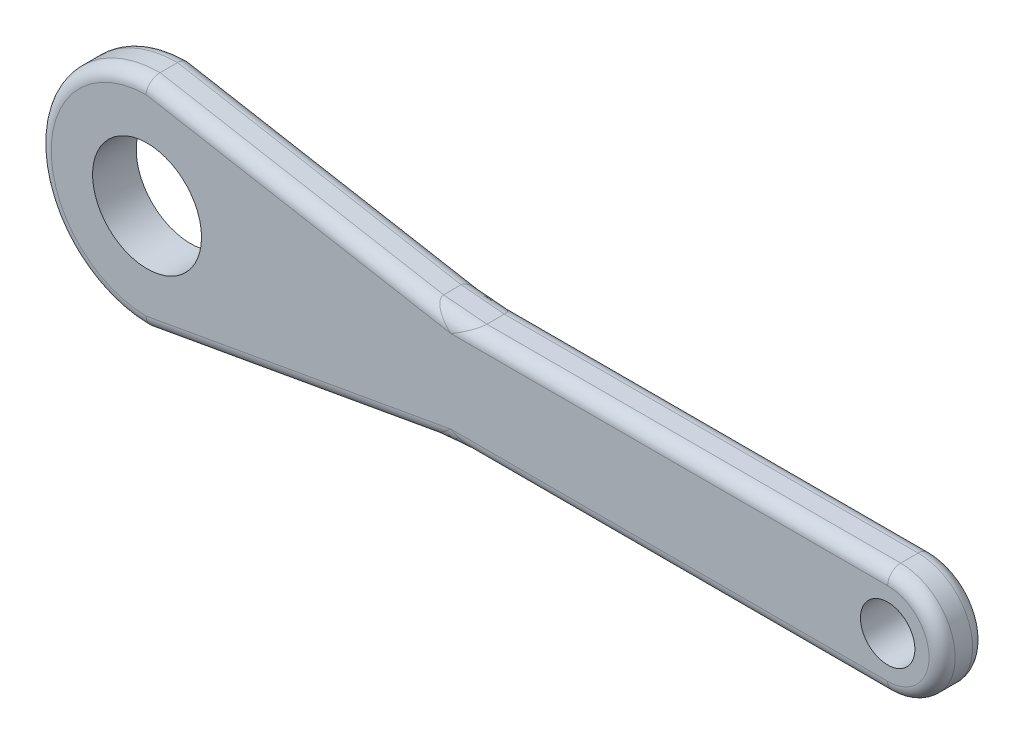
ISO-10303-21;
HEADER;
FILE_DESCRIPTION(('STEP AP214'),'2;1');
FILE_NAME('part.step','',(''),(''),'','','');
FILE_SCHEMA(('AUTOMOTIVE_DESIGN { 1 0 10303 214 1 1 1 1 }'));
ENDSEC;
DATA;
#1=APPLICATION_CONTEXT('core data for automotive mechanical design processes');
#2=APPLICATION_PROTOCOL_DEFINITION('international standard','automotive_design',2000,#1);
#3=PRODUCT_CONTEXT('',#1,'mechanical');
#4=PRODUCT('Part','Part','',(#3));
#5=PRODUCT_RELATED_PRODUCT_CATEGORY('part','',(#4));
#6=PRODUCT_DEFINITION_FORMATION('','',#4);
#7=PRODUCT_DEFINITION_CONTEXT('part definition',#1,'design');
#8=PRODUCT_DEFINITION('design','',#6,#7);
#9=PRODUCT_DEFINITION_SHAPE('','',#8);
#10=(LENGTH_UNIT() NAMED_UNIT(*) SI_UNIT(.MILLI.,.METRE.));
#11=(NAMED_UNIT(*) PLANE_ANGLE_UNIT() SI_UNIT($,.RADIAN.));
#12=(NAMED_UNIT(*) SI_UNIT($,.STERADIAN.) SOLID_ANGLE_UNIT());
#13=UNCERTAINTY_MEASURE_WITH_UNIT(LENGTH_MEASURE(1.E-05),#10,'distance_accuracy_value','');
#14=(GEOMETRIC_REPRESENTATION_CONTEXT(3) GLOBAL_UNCERTAINTY_ASSIGNED_CONTEXT((#13)) GLOBAL_UNIT_ASSIGNED_CONTEXT((#10,
#11,#12)) REPRESENTATION_CONTEXT('',''));
#15=CARTESIAN_POINT('',(0.,0.,0.));
#16=DIRECTION('',(0.,0.,1.));
#17=DIRECTION('',(1.,0.,0.));
#18=AXIS2_PLACEMENT_3D('',#15,#16,#17);
#19=CARTESIAN_POINT('',(0.,0.,10.));
#20=DIRECTION('',(0.,0.,-1.));
#21=DIRECTION('',(-1.,0.,0.));
#22=AXIS2_PLACEMENT_3D('',#19,#20,#21);
#23=CYLINDRICAL_SURFACE('',#22,25.);
#24=DIRECTION('',(0.,0.,-1.));
#25=VECTOR('',#24,1.);
#26=CARTESIAN_POINT('',(0.,-25.,10.));
#27=LINE('',#26,#25);
#28=CARTESIAN_POINT('',(0.,-25.,7.));
#29=VERTEX_POINT('',#28);
#30=CARTESIAN_POINT('',(0.,-25.,3.));
#31=VERTEX_POINT('',#30);
#32=EDGE_CURVE('E182',#29,#31,#27,.T.);
#33=ORIENTED_EDGE('',*,*,#32,.F.);
#34=CARTESIAN_POINT('',(0.,0.,7.));
#35=DIRECTION('',(0.,0.,1.));
#36=DIRECTION('',(1.,0.,0.));
#37=AXIS2_PLACEMENT_3D('',#34,#35,#36);
#38=CIRCLE('',#37,25.);
#39=CARTESIAN_POINT('',(0.,25.,7.));
#40=VERTEX_POINT('',#39);
#41=EDGE_CURVE('E396',#29,#40,#38,.F.);
#42=ORIENTED_EDGE('',*,*,#41,.T.);
#43=DIRECTION('',(0.,0.,-1.));
#44=VECTOR('',#43,1.);
#45=CARTESIAN_POINT('',(0.,25.,10.));
#46=LINE('',#45,#44);
#47=CARTESIAN_POINT('',(0.,25.,3.));
#48=VERTEX_POINT('',#47);
#49=EDGE_CURVE('E701',#40,#48,#46,.T.);
#50=ORIENTED_EDGE('',*,*,#49,.T.);
#51=CARTESIAN_POINT('',(0.,0.,3.));
#52=DIRECTION('',(0.,0.,1.));
#53=DIRECTION('',(1.,0.,0.));
#54=AXIS2_PLACEMENT_3D('',#51,#52,#53);
#55=CIRCLE('',#54,25.);
#56=EDGE_CURVE('E399',#48,#31,#55,.T.);
#57=ORIENTED_EDGE('',*,*,#56,.T.);
#58=EDGE_LOOP('',(#33,#42,#50,#57));
#59=FACE_BOUND('',#58,.T.);
#60=ADVANCED_FACE('F47',(#59),#23,.T.);
#61=CARTESIAN_POINT('',(0.,-25.,10.));
#62=DIRECTION('',(-0.175790638483658,0.984427575508482,0.));
#63=DIRECTION('',(-0.984427575508482,-0.175790638483658,0.));
#64=AXIS2_PLACEMENT_3D('',#61,#62,#63);
#65=PLANE('',#64);
#66=DIRECTION('',(0.984427575508482,0.175790638483658,0.));
#67=VECTOR('',#66,1.);
#68=CARTESIAN_POINT('',(0.,-25.,3.));
#69=LINE('',#68,#67);
#70=CARTESIAN_POINT('',(65.0778621224578,-13.3789531924183,3.));
#71=VERTEX_POINT('',#70);
#72=EDGE_CURVE('E171',#31,#71,#69,.T.);
#73=ORIENTED_EDGE('',*,*,#72,.T.);
#74=DIRECTION('',(0.,0.,1.));
#75=VECTOR('',#74,1.);
#76=CARTESIAN_POINT('',(65.0778621224578,-13.3789531924183,7.));
#77=LINE('',#76,#75);
#78=CARTESIAN_POINT('',(65.0778621224578,-13.3789531924183,7.));
#79=VERTEX_POINT('',#78);
#80=EDGE_CURVE('E716',#71,#79,#77,.T.);
#81=ORIENTED_EDGE('',*,*,#80,.T.);
#82=DIRECTION('',(0.984427575508482,0.175790638483658,0.));
#83=VECTOR('',#82,1.);
#84=CARTESIAN_POINT('',(0.,-25.,7.));
#85=LINE('',#84,#83);
#86=EDGE_CURVE('E285',#79,#29,#85,.F.);
#87=ORIENTED_EDGE('',*,*,#86,.T.);
#88=ORIENTED_EDGE('',*,*,#32,.T.);
#89=EDGE_LOOP('',(#73,#81,#87,#88));
#90=FACE_BOUND('',#89,.T.);
#91=ADVANCED_FACE('F318',(#90),#65,.F.);
#92=CARTESIAN_POINT('',(70.,-12.5,10.));
#93=DIRECTION('',(0.,1.,0.));
#94=DIRECTION('',(-1.,0.,0.));
#95=AXIS2_PLACEMENT_3D('',#92,#93,#94);
#96=PLANE('',#95);
#97=DIRECTION('',(1.,0.,0.));
#98=VECTOR('',#97,1.);
#99=CARTESIAN_POINT('',(70.,-12.5,7.));
#100=LINE('',#99,#98);
#101=CARTESIAN_POINT('',(170.,-12.5,7.));
#102=VERTEX_POINT('',#101);
#103=CARTESIAN_POINT('',(74.9999999999999,-12.5,7.));
#104=VERTEX_POINT('',#103);
#105=EDGE_CURVE('E177',#102,#104,#100,.F.);
#106=ORIENTED_EDGE('',*,*,#105,.T.);
#107=DIRECTION('',(0.,0.,-1.));
#108=VECTOR('',#107,1.);
#109=CARTESIAN_POINT('',(74.9999999999999,-12.5,3.));
#110=LINE('',#109,#108);
#111=CARTESIAN_POINT('',(74.9999999999999,-12.5,3.));
#112=VERTEX_POINT('',#111);
#113=EDGE_CURVE('E367',#104,#112,#110,.T.);
#114=ORIENTED_EDGE('',*,*,#113,.T.);
#115=DIRECTION('',(1.,0.,0.));
#116=VECTOR('',#115,1.);
#117=CARTESIAN_POINT('',(70.,-12.5,3.));
#118=LINE('',#117,#116);
#119=CARTESIAN_POINT('',(170.,-12.5,3.));
#120=VERTEX_POINT('',#119);
#121=EDGE_CURVE('E179',#112,#120,#118,.T.);
#122=ORIENTED_EDGE('',*,*,#121,.T.);
#123=DIRECTION('',(0.,0.,-1.));
#124=VECTOR('',#123,1.);
#125=CARTESIAN_POINT('',(170.,-12.5,10.));
#126=LINE('',#125,#124);
#127=EDGE_CURVE('E162',#102,#120,#126,.T.);
#128=ORIENTED_EDGE('',*,*,#127,.F.);
#129=EDGE_LOOP('',(#106,#114,#122,#128));
#130=FACE_BOUND('',#129,.T.);
#131=ADVANCED_FACE('F176',(#130),#96,.F.);
#132=CARTESIAN_POINT('',(170.,0.,10.));
#133=DIRECTION('',(0.,0.,-1.));
#134=DIRECTION('',(-1.,0.,0.));
#135=AXIS2_PLACEMENT_3D('',#132,#133,#134);
#136=CYLINDRICAL_SURFACE('',#135,12.5);
#137=ORIENTED_EDGE('',*,*,#127,.T.);
#138=CARTESIAN_POINT('',(170.,0.,3.));
#139=DIRECTION('',(0.,0.,1.));
#140=DIRECTION('',(1.,0.,0.));
#141=AXIS2_PLACEMENT_3D('',#138,#139,#140);
#142=CIRCLE('',#141,12.5);
#143=CARTESIAN_POINT('',(170.,12.5,3.));
#144=VERTEX_POINT('',#143);
#145=EDGE_CURVE('E170',#120,#144,#142,.T.);
#146=ORIENTED_EDGE('',*,*,#145,.T.);
#147=DIRECTION('',(0.,0.,-1.));
#148=VECTOR('',#147,1.);
#149=CARTESIAN_POINT('',(170.,12.5,10.));
#150=LINE('',#149,#148);
#151=CARTESIAN_POINT('',(170.,12.5,7.));
#152=VERTEX_POINT('',#151);
#153=EDGE_CURVE('E164',#152,#144,#150,.T.);
#154=ORIENTED_EDGE('',*,*,#153,.F.);
#155=CARTESIAN_POINT('',(170.,0.,7.));
#156=DIRECTION('',(0.,0.,1.));
#157=DIRECTION('',(1.,0.,0.));
#158=AXIS2_PLACEMENT_3D('',#155,#156,#157);
#159=CIRCLE('',#158,12.5);
#160=EDGE_CURVE('E159',#152,#102,#159,.F.);
#161=ORIENTED_EDGE('',*,*,#160,.T.);
#162=EDGE_LOOP('',(#137,#146,#154,#161));
#163=FACE_BOUND('',#162,.T.);
#164=ADVANCED_FACE('F161',(#163),#136,.T.);
#165=CARTESIAN_POINT('',(70.,12.5,10.));
#166=DIRECTION('',(0.,1.,0.));
#167=DIRECTION('',(-1.,0.,0.));
#168=AXIS2_PLACEMENT_3D('',#165,#166,#167);
#169=PLANE('',#168);
#170=DIRECTION('',(1.,0.,0.));
#171=VECTOR('',#170,1.);
#172=CARTESIAN_POINT('',(70.,12.5,3.));
#173=LINE('',#172,#171);
#174=CARTESIAN_POINT('',(74.9999999999997,12.5,3.));
#175=VERTEX_POINT('',#174);
#176=EDGE_CURVE('E635',#144,#175,#173,.F.);
#177=ORIENTED_EDGE('',*,*,#176,.T.);
#178=DIRECTION('',(0.,0.,1.));
#179=VECTOR('',#178,1.);
#180=CARTESIAN_POINT('',(74.9999999999997,12.5,7.));
#181=LINE('',#180,#179);
#182=CARTESIAN_POINT('',(74.9999999999997,12.5,7.));
#183=VERTEX_POINT('',#182);
#184=EDGE_CURVE('E11',#175,#183,#181,.T.);
#185=ORIENTED_EDGE('',*,*,#184,.T.);
#186=DIRECTION('',(1.,0.,0.));
#187=VECTOR('',#186,1.);
#188=CARTESIAN_POINT('',(70.,12.5,7.));
#189=LINE('',#188,#187);
#190=EDGE_CURVE('E634',#183,#152,#189,.T.);
#191=ORIENTED_EDGE('',*,*,#190,.T.);
#192=ORIENTED_EDGE('',*,*,#153,.T.);
#193=EDGE_LOOP('',(#177,#185,#191,#192));
#194=FACE_BOUND('',#193,.T.);
#195=ADVANCED_FACE('F633',(#194),#169,.T.);
#196=CARTESIAN_POINT('',(0.,25.,10.));
#197=DIRECTION('',(0.175790638483658,0.984427575508482,0.));
#198=DIRECTION('',(-0.984427575508482,0.175790638483658,0.));
#199=AXIS2_PLACEMENT_3D('',#196,#197,#198);
#200=PLANE('',#199);
#201=DIRECTION('',(0.984427575508482,-0.175790638483658,0.));
#202=VECTOR('',#201,1.);
#203=CARTESIAN_POINT('',(0.,25.,7.));
#204=LINE('',#203,#202);
#205=CARTESIAN_POINT('',(65.0778621224578,13.3789531924182,7.));
#206=VERTEX_POINT('',#205);
#207=EDGE_CURVE('E411',#40,#206,#204,.T.);
#208=ORIENTED_EDGE('',*,*,#207,.T.);
#209=DIRECTION('',(0.,0.,-1.));
#210=VECTOR('',#209,1.);
#211=CARTESIAN_POINT('',(65.0778621224578,13.3789531924182,3.));
#212=LINE('',#211,#210);
#213=CARTESIAN_POINT('',(65.0778621224578,13.3789531924182,3.));
#214=VERTEX_POINT('',#213);
#215=EDGE_CURVE('E62',#206,#214,#212,.T.);
#216=ORIENTED_EDGE('',*,*,#215,.T.);
#217=DIRECTION('',(0.984427575508482,-0.175790638483658,0.));
#218=VECTOR('',#217,1.);
#219=CARTESIAN_POINT('',(0.,25.,3.));
#220=LINE('',#219,#218);
#221=EDGE_CURVE('E402',#214,#48,#220,.F.);
#222=ORIENTED_EDGE('',*,*,#221,.T.);
#223=ORIENTED_EDGE('',*,*,#49,.F.);
#224=EDGE_LOOP('',(#208,#216,#222,#223));
#225=FACE_BOUND('',#224,.T.);
#226=ADVANCED_FACE('F740',(#225),#200,.T.);
#227=CARTESIAN_POINT('',(0.,0.,10.));
#228=DIRECTION('',(0.,0.,1.));
#229=DIRECTION('',(1.,0.,0.));
#230=AXIS2_PLACEMENT_3D('',#227,#228,#229);
#231=PLANE('',#230);
#232=DIRECTION('',(0.984427575508482,0.175790638483658,0.));
#233=VECTOR('',#232,1.);
#234=CARTESIAN_POINT('',(69.472628084549,-9.54671727347455,10.));
#235=LINE('',#234,#233);
#236=CARTESIAN_POINT('',(-0.257327238388273,-21.9984950097134,10.));
#237=VERTEX_POINT('',#236);
#238=CARTESIAN_POINT('',(69.7342448160065,-9.5,10.));
#239=VERTEX_POINT('',#238);
#240=EDGE_CURVE('E280',#237,#239,#235,.T.);
#241=ORIENTED_EDGE('',*,*,#240,.T.);
#242=DIRECTION('',(1.,0.,0.));
#243=VECTOR('',#242,1.);
#244=CARTESIAN_POINT('',(170.,-9.50000000000001,10.));
#245=LINE('',#244,#243);
#246=CARTESIAN_POINT('',(170.,-9.50000000000001,10.));
#247=VERTEX_POINT('',#246);
#248=EDGE_CURVE('E288',#239,#247,#245,.T.);
#249=ORIENTED_EDGE('',*,*,#248,.T.);
#250=CARTESIAN_POINT('',(170.,0.,10.));
#251=DIRECTION('',(0.,0.,1.));
#252=DIRECTION('',(1.,0.,0.));
#253=AXIS2_PLACEMENT_3D('',#250,#251,#252);
#254=CIRCLE('',#253,9.50000000000001);
#255=CARTESIAN_POINT('',(170.,9.50000000000001,10.));
#256=VERTEX_POINT('',#255);
#257=EDGE_CURVE('E196',#247,#256,#254,.T.);
#258=ORIENTED_EDGE('',*,*,#257,.T.);
#259=DIRECTION('',(1.,0.,0.));
#260=VECTOR('',#259,1.);
#261=CARTESIAN_POINT('',(0.,9.5,10.));
#262=LINE('',#261,#260);
#263=CARTESIAN_POINT('',(69.7342448160065,9.5,10.));
#264=VERTEX_POINT('',#263);
#265=EDGE_CURVE('E281',#256,#264,#262,.F.);
#266=ORIENTED_EDGE('',*,*,#265,.T.);
#267=DIRECTION('',(0.984427575508482,-0.175790638483658,0.));
#268=VECTOR('',#267,1.);
#269=CARTESIAN_POINT('',(3.7989568855379,21.2741585590123,10.));
#270=LINE('',#269,#268);
#271=CARTESIAN_POINT('',(-0.257327238388275,21.9984950097134,10.));
#272=VERTEX_POINT('',#271);
#273=EDGE_CURVE('E276',#264,#272,#270,.F.);
#274=ORIENTED_EDGE('',*,*,#273,.T.);
#275=CARTESIAN_POINT('',(0.,0.,10.));
#276=DIRECTION('',(0.,0.,1.));
#277=DIRECTION('',(1.,0.,0.));
#278=AXIS2_PLACEMENT_3D('',#275,#276,#277);
#279=CIRCLE('',#278,22.);
#280=EDGE_CURVE('E273',#272,#237,#279,.T.);
#281=ORIENTED_EDGE('',*,*,#280,.T.);
#282=EDGE_LOOP('',(#241,#249,#258,#266,#274,#281));
#283=FACE_BOUND('',#282,.T.);
#284=CARTESIAN_POINT('',(0.,0.,10.));
#285=DIRECTION('',(0.,0.,1.));
#286=DIRECTION('',(1.,0.,0.));
#287=AXIS2_PLACEMENT_3D('',#284,#285,#286);
#288=CIRCLE('',#287,12.5);
#289=CARTESIAN_POINT('',(12.5,0.,10.));
#290=VERTEX_POINT('',#289);
#291=EDGE_CURVE('E697',#290,#290,#288,.T.);
#292=ORIENTED_EDGE('',*,*,#291,.F.);
#293=EDGE_LOOP('',(#292));
#294=FACE_BOUND('',#293,.T.);
#295=CARTESIAN_POINT('',(170.,0.,10.));
#296=DIRECTION('',(0.,0.,1.));
#297=DIRECTION('',(1.,0.,0.));
#298=AXIS2_PLACEMENT_3D('',#295,#296,#297);
#299=CIRCLE('',#298,6.25);
#300=CARTESIAN_POINT('',(176.25,0.,10.));
#301=VERTEX_POINT('',#300);
#302=EDGE_CURVE('E691',#301,#301,#299,.T.);
#303=ORIENTED_EDGE('',*,*,#302,.F.);
#304=EDGE_LOOP('',(#303));
#305=FACE_BOUND('',#304,.T.);
#306=ADVANCED_FACE('F742',(#283,#294,#305),#231,.T.);
#307=CARTESIAN_POINT('',(0.,0.,0.));
#308=DIRECTION('',(0.,0.,1.));
#309=DIRECTION('',(1.,0.,0.));
#310=AXIS2_PLACEMENT_3D('',#307,#308,#309);
#311=PLANE('',#310);
#312=CARTESIAN_POINT('',(170.,0.,0.));
#313=DIRECTION('',(0.,0.,1.));
#314=DIRECTION('',(1.,0.,0.));
#315=AXIS2_PLACEMENT_3D('',#312,#313,#314);
#316=CIRCLE('',#315,9.50000000000001);
#317=CARTESIAN_POINT('',(170.,9.50000000000001,0.));
#318=VERTEX_POINT('',#317);
#319=CARTESIAN_POINT('',(170.,-9.50000000000001,0.));
#320=VERTEX_POINT('',#319);
#321=EDGE_CURVE('E268',#318,#320,#316,.F.);
#322=ORIENTED_EDGE('',*,*,#321,.T.);
#323=DIRECTION('',(1.,0.,0.));
#324=VECTOR('',#323,1.);
#325=CARTESIAN_POINT('',(0.,-9.5,0.));
#326=LINE('',#325,#324);
#327=CARTESIAN_POINT('',(69.7342448160065,-9.5,0.));
#328=VERTEX_POINT('',#327);
#329=EDGE_CURVE('E277',#320,#328,#326,.F.);
#330=ORIENTED_EDGE('',*,*,#329,.T.);
#331=DIRECTION('',(0.984427575508482,0.175790638483658,0.));
#332=VECTOR('',#331,1.);
#333=CARTESIAN_POINT('',(3.7989568855379,-21.2741585590123,0.));
#334=LINE('',#333,#332);
#335=CARTESIAN_POINT('',(-0.257327238388275,-21.9984950097134,0.));
#336=VERTEX_POINT('',#335);
#337=EDGE_CURVE('E271',#328,#336,#334,.F.);
#338=ORIENTED_EDGE('',*,*,#337,.T.);
#339=CARTESIAN_POINT('',(0.,0.,0.));
#340=DIRECTION('',(0.,0.,1.));
#341=DIRECTION('',(1.,0.,0.));
#342=AXIS2_PLACEMENT_3D('',#339,#340,#341);
#343=CIRCLE('',#342,22.);
#344=CARTESIAN_POINT('',(-0.257327238388273,21.9984950097134,0.));
#345=VERTEX_POINT('',#344);
#346=EDGE_CURVE('E258',#336,#345,#343,.F.);
#347=ORIENTED_EDGE('',*,*,#346,.T.);
#348=DIRECTION('',(0.984427575508482,-0.175790638483658,0.));
#349=VECTOR('',#348,1.);
#350=CARTESIAN_POINT('',(69.472628084549,9.54671727347455,0.));
#351=LINE('',#350,#349);
#352=CARTESIAN_POINT('',(69.7342448160065,9.5,0.));
#353=VERTEX_POINT('',#352);
#354=EDGE_CURVE('E267',#345,#353,#351,.T.);
#355=ORIENTED_EDGE('',*,*,#354,.T.);
#356=DIRECTION('',(1.,0.,0.));
#357=VECTOR('',#356,1.);
#358=CARTESIAN_POINT('',(170.,9.50000000000001,0.));
#359=LINE('',#358,#357);
#360=EDGE_CURVE('E272',#353,#318,#359,.T.);
#361=ORIENTED_EDGE('',*,*,#360,.T.);
#362=EDGE_LOOP('',(#322,#330,#338,#347,#355,#361));
#363=FACE_BOUND('',#362,.T.);
#364=CARTESIAN_POINT('',(0.,0.,0.));
#365=DIRECTION('',(0.,0.,1.));
#366=DIRECTION('',(1.,0.,0.));
#367=AXIS2_PLACEMENT_3D('',#364,#365,#366);
#368=CIRCLE('',#367,12.5);
#369=CARTESIAN_POINT('',(12.5,0.,0.));
#370=VERTEX_POINT('',#369);
#371=EDGE_CURVE('E705',#370,#370,#368,.T.);
#372=ORIENTED_EDGE('',*,*,#371,.T.);
#373=EDGE_LOOP('',(#372));
#374=FACE_BOUND('',#373,.T.);
#375=CARTESIAN_POINT('',(170.,0.,0.));
#376=DIRECTION('',(0.,0.,1.));
#377=DIRECTION('',(1.,0.,0.));
#378=AXIS2_PLACEMENT_3D('',#375,#376,#377);
#379=CIRCLE('',#378,6.25);
#380=CARTESIAN_POINT('',(176.25,0.,0.));
#381=VERTEX_POINT('',#380);
#382=EDGE_CURVE('E688',#381,#381,#379,.T.);
#383=ORIENTED_EDGE('',*,*,#382,.T.);
#384=EDGE_LOOP('',(#383));
#385=FACE_BOUND('',#384,.T.);
#386=ADVANCED_FACE('F680',(#363,#374,#385),#311,.F.);
#387=CARTESIAN_POINT('',(170.,0.,0.));
#388=DIRECTION('',(0.,0.,1.));
#389=DIRECTION('',(1.,0.,0.));
#390=AXIS2_PLACEMENT_3D('',#387,#388,#389);
#391=CYLINDRICAL_SURFACE('',#390,6.25);
#392=ORIENTED_EDGE('',*,*,#382,.F.);
#393=EDGE_LOOP('',(#392));
#394=FACE_BOUND('',#393,.T.);
#395=ORIENTED_EDGE('',*,*,#302,.T.);
#396=EDGE_LOOP('',(#395));
#397=FACE_BOUND('',#396,.T.);
#398=ADVANCED_FACE('F787',(#394,#397),#391,.F.);
#399=CARTESIAN_POINT('',(0.,0.,0.));
#400=DIRECTION('',(0.,0.,1.));
#401=DIRECTION('',(1.,0.,0.));
#402=AXIS2_PLACEMENT_3D('',#399,#400,#401);
#403=CYLINDRICAL_SURFACE('',#402,12.5);
#404=ORIENTED_EDGE('',*,*,#371,.F.);
#405=EDGE_LOOP('',(#404));
#406=FACE_BOUND('',#405,.T.);
#407=ORIENTED_EDGE('',*,*,#291,.T.);
#408=EDGE_LOOP('',(#407));
#409=FACE_BOUND('',#408,.T.);
#410=ADVANCED_FACE('F795',(#406,#409),#403,.F.);
#411=CARTESIAN_POINT('',(3.7989568855379,21.2741585590123,3.));
#412=DIRECTION('',(-0.984427575508482,0.175790638483658,0.));
#413=DIRECTION('',(-0.175790638483658,-0.984427575508482,0.));
#414=AXIS2_PLACEMENT_3D('',#411,#412,#413);
#415=CYLINDRICAL_SURFACE('',#414,3.);
#416=ORIENTED_EDGE('',*,*,#221,.F.);
#417=CARTESIAN_POINT('',(69.7342448160066,9.49999999999999,0.));
#418=CARTESIAN_POINT('',(68.5135068743807,10.516923575104,-0.00318682172784394));
#419=CARTESIAN_POINT('',(67.3048815947981,11.5237568178204,0.322542018701456));
#420=CARTESIAN_POINT('',(65.5784884803991,12.9619113947079,1.43481729417927));
#421=CARTESIAN_POINT('',(65.0729157686108,13.3830737031899,2.21350669266261));
#422=CARTESIAN_POINT('',(65.0778621224578,13.3789531924182,3.));
#423=B_SPLINE_CURVE_WITH_KNOTS('',3,(#417,#418,#419,#420,#421,#422),.UNSPECIFIED.,.F.,.F.,(4,2,
4),(3.14159265358979,3.92699081698724,4.71238898038469),.UNSPECIFIED.);
#424=EDGE_CURVE('E418',#214,#353,#423,.F.);
#425=ORIENTED_EDGE('',*,*,#424,.T.);
#426=ORIENTED_EDGE('',*,*,#354,.F.);
#427=CARTESIAN_POINT('',(0.,25.,3.));
#428=CARTESIAN_POINT('',(8.7085151027393E-07,25.0000082337955,2.91586638756877));
#429=CARTESIAN_POINT('',(-0.0003135154808949,24.9964608064281,2.83173670505606));
#430=CARTESIAN_POINT('',(-0.00156613641970176,24.982318313516,2.66408097308371));
#431=CARTESIAN_POINT('',(-0.0025043365825294,24.9717236370815,2.58055489055396));
#432=CARTESIAN_POINT('',(-0.00499692725475994,24.9435615386325,2.41475877472728));
#433=CARTESIAN_POINT('',(-0.00655082630696407,24.9259996778824,2.33248779385642));
#434=CARTESIAN_POINT('',(-0.0102599497474648,24.8840482785992,2.16974393992692));
#435=CARTESIAN_POINT('',(-0.0124151676501333,24.8596588137064,2.08927104748481));
#436=CARTESIAN_POINT('',(-0.019760905491985,24.7764533568628,1.85133186340131));
#437=CARTESIAN_POINT('',(-0.0258326410623305,24.7075875671628,1.69727052085856));
#438=CARTESIAN_POINT('',(-0.0401121156190309,24.5451545024943,1.40303346952755));
#439=CARTESIAN_POINT('',(-0.0483194238592753,24.4515922087684,1.2628549684259));
#440=CARTESIAN_POINT('',(-0.0666154871435365,24.2422447713745,0.999950759377807));
#441=CARTESIAN_POINT('',(-0.0767072633191261,24.126423934548,0.877253641936504));
#442=CARTESIAN_POINT('',(-0.0984370575409814,23.875926174408,0.652999626413795));
#443=CARTESIAN_POINT('',(-0.110075567702717,23.7412432491153,0.551449483049751));
#444=CARTESIAN_POINT('',(-0.134571177341969,23.4563246908936,0.371986271246784));
#445=CARTESIAN_POINT('',(-0.147432907765865,23.3060297376252,0.294168134350286));
#446=CARTESIAN_POINT('',(-0.173929893750998,22.9946225172639,0.164905367377188));
#447=CARTESIAN_POINT('',(-0.187564574985776,22.833518265893,0.113441433343793));
#448=CARTESIAN_POINT('',(-0.210280249340345,22.5634514797078,0.0515676925899749));
#449=CARTESIAN_POINT('',(-0.219261848938276,22.4562531723518,0.0330715027635641));
#450=CARTESIAN_POINT('',(-0.237256163085491,22.2405976776065,0.00780570670213559));
#451=CARTESIAN_POINT('',(-0.246268801416115,22.1321428705333,0.00101672013653875));
#452=CARTESIAN_POINT('',(-0.255936348115522,22.015312045615,3.51960844525561E-05));
#453=CARTESIAN_POINT('',(-0.256631931223679,22.006903253676,-9.1545239450453E-08));
#454=CARTESIAN_POINT('',(-0.25732723838826,21.9984950097134,0.));
#455=B_SPLINE_CURVE_WITH_KNOTS('',3,(#427,#428,#429,#430,#431,#432,#433,#434,#435,#436,#437,
#438,#439,#440,#441,#442,#443,#444,#445,#446,#447,#448,#449,#450,#451,#452,#453,#454),
.UNSPECIFIED.,.F.,.F.,(4,2,2,2,2,2,2,2,2,2,2,2,2,4),(0.,0.25231842788974,0.504622925298267,
0.756726435059673,1.00882722582033,1.5128047677286,2.01668073579764,2.52137155053236,
3.026223325997,3.53306886646753,4.03954261918439,4.36645140475563,4.69281849782802,
4.71813090580682),.UNSPECIFIED.);
#456=EDGE_CURVE('E209',#48,#345,#455,.T.);
#457=ORIENTED_EDGE('',*,*,#456,.F.);
#458=EDGE_LOOP('',(#416,#425,#426,#457));
#459=FACE_BOUND('',#458,.T.);
#460=ADVANCED_FACE('F309',(#459),#415,.T.);
#461=CARTESIAN_POINT('',(0.,0.,3.));
#462=DIRECTION('',(0.,0.,1.));
#463=DIRECTION('',(1.,0.,0.));
#464=AXIS2_PLACEMENT_3D('',#461,#462,#463);
#465=TOROIDAL_SURFACE('',#464,22.,3.);
#466=ORIENTED_EDGE('',*,*,#456,.T.);
#467=ORIENTED_EDGE('',*,*,#346,.F.);
#468=CARTESIAN_POINT('',(0.,-25.,3.));
#469=CARTESIAN_POINT('',(8.70851503985456E-07,-25.0000082337955,2.91586638756877));
#470=CARTESIAN_POINT('',(-0.000313515480902793,-24.9964608064281,2.83173670505606));
#471=CARTESIAN_POINT('',(-0.00156613641970957,-24.982318313516,2.66408097308371));
#472=CARTESIAN_POINT('',(-0.00250433658253553,-24.9717236370815,2.58055489055396));
#473=CARTESIAN_POINT('',(-0.00499692725476549,-24.9435615386325,2.41475877472728));
#474=CARTESIAN_POINT('',(-0.00655082630697074,-24.9259996778824,2.33248779385642));
#475=CARTESIAN_POINT('',(-0.0102599497474712,-24.8840482785992,2.16974393992692));
#476=CARTESIAN_POINT('',(-0.0124151676501384,-24.8596588137064,2.08927104748481));
#477=CARTESIAN_POINT('',(-0.019760905491983,-24.7764533568628,1.85133186340131));
#478=CARTESIAN_POINT('',(-0.0258326410623196,-24.7075875671628,1.69727052085856));
#479=CARTESIAN_POINT('',(-0.0401121156190228,-24.5451545024943,1.40303346952755));
#480=CARTESIAN_POINT('',(-0.0483194238592789,-24.4515922087684,1.2628549684259));
#481=CARTESIAN_POINT('',(-0.06661548714355,-24.2422447713745,0.999950759377806));
#482=CARTESIAN_POINT('',(-0.0767072633191379,-24.126423934548,0.877253641936503));
#483=CARTESIAN_POINT('',(-0.0984370575409791,-23.875926174408,0.652999626413795));
#484=CARTESIAN_POINT('',(-0.110075567702703,-23.7412432491153,0.551449483049752));
#485=CARTESIAN_POINT('',(-0.134571177341958,-23.4563246908936,0.371986271246785));
#486=CARTESIAN_POINT('',(-0.14743290776587,-23.3060297376252,0.294168134350286));
#487=CARTESIAN_POINT('',(-0.173929893751009,-22.9946225172639,0.164905367377187));
#488=CARTESIAN_POINT('',(-0.187564574985777,-22.833518265893,0.113441433343793));
#489=CARTESIAN_POINT('',(-0.210280249340352,-22.5634514797078,0.0515676925899749));
#490=CARTESIAN_POINT('',(-0.219261848938291,-22.4562531723518,0.0330715027635642));
#491=CARTESIAN_POINT('',(-0.237256163085497,-22.2405976776065,0.00780570670213581));
#492=CARTESIAN_POINT('',(-0.246268801416105,-22.1321428705333,0.00101672013653932));
#493=CARTESIAN_POINT('',(-0.255936348115526,-22.015312045615,3.51960844526416E-05));
#494=CARTESIAN_POINT('',(-0.256631931223685,-22.006903253676,-9.15452394051582E-08));
#495=CARTESIAN_POINT('',(-0.257327238388267,-21.9984950097134,0.));
#496=B_SPLINE_CURVE_WITH_KNOTS('',3,(#468,#469,#470,#471,#472,#473,#474,#475,#476,#477,#478,
#479,#480,#481,#482,#483,#484,#485,#486,#487,#488,#489,#490,#491,#492,#493,#494,#495),
.UNSPECIFIED.,.F.,.F.,(4,2,2,2,2,2,2,2,2,2,2,2,2,4),(0.,0.25231842788974,0.504622925298268,
0.756726435059675,1.00882722582033,1.5128047677286,2.01668073579764,2.52137155053236,
3.02622332599699,3.53306886646753,4.03954261918439,4.36645140475563,4.69281849782802,
4.71813090580682),.UNSPECIFIED.);
#497=EDGE_CURVE('E381',#31,#336,#496,.T.);
#498=ORIENTED_EDGE('',*,*,#497,.F.);
#499=ORIENTED_EDGE('',*,*,#56,.F.);
#500=EDGE_LOOP('',(#466,#467,#498,#499));
#501=FACE_BOUND('',#500,.T.);
#502=ADVANCED_FACE('F378',(#501),#465,.T.);
#503=CARTESIAN_POINT('',(0.,9.5,3.));
#504=DIRECTION('',(-1.,0.,0.));
#505=DIRECTION('',(0.,-1.,0.));
#506=AXIS2_PLACEMENT_3D('',#503,#504,#505);
#507=CYLINDRICAL_SURFACE('',#506,3.);
#508=ORIENTED_EDGE('',*,*,#360,.F.);
#509=CARTESIAN_POINT('',(74.9999999999998,12.5,3.));
#510=CARTESIAN_POINT('',(75.0055936743444,12.5031868217278,2.21350669266262));
#511=CARTESIAN_POINT('',(74.4338575643222,12.1774579812985,1.43481729417926));
#512=CARTESIAN_POINT('',(72.4815344650306,11.0651827058207,0.322542018701464));
#513=CARTESIAN_POINT('',(71.1147385527691,10.2864933073374,-0.00318682172784394));
#514=CARTESIAN_POINT('',(69.7342448160065,9.5,0.));
#515=B_SPLINE_CURVE_WITH_KNOTS('',3,(#509,#510,#511,#512,#513,#514),.UNSPECIFIED.,.F.,.F.,(4,2,
4),(3.14159265358979,3.92699081698724,4.71238898038469),.UNSPECIFIED.);
#516=EDGE_CURVE('E77',#353,#175,#515,.F.);
#517=ORIENTED_EDGE('',*,*,#516,.T.);
#518=ORIENTED_EDGE('',*,*,#176,.F.);
#519=CARTESIAN_POINT('',(170.,9.50000000000001,3.));
#520=DIRECTION('',(1.,0.,0.));
#521=DIRECTION('',(0.,0.,-1.));
#522=AXIS2_PLACEMENT_3D('',#519,#520,#521);
#523=CIRCLE('',#522,3.);
#524=EDGE_CURVE('E389',#318,#144,#523,.T.);
#525=ORIENTED_EDGE('',*,*,#524,.F.);
#526=EDGE_LOOP('',(#508,#517,#518,#525));
#527=FACE_BOUND('',#526,.T.);
#528=ADVANCED_FACE('F377',(#527),#507,.T.);
#529=CARTESIAN_POINT('',(-0.527371915450973,-22.0467172734746,3.));
#530=DIRECTION('',(0.984427575508482,0.175790638483658,0.));
#531=DIRECTION('',(-0.175790638483658,0.984427575508482,0.));
#532=AXIS2_PLACEMENT_3D('',#529,#530,#531);
#533=CYLINDRICAL_SURFACE('',#532,3.);
#534=ORIENTED_EDGE('',*,*,#337,.F.);
#535=CARTESIAN_POINT('',(65.0778621224579,-13.3789531924183,3.));
#536=CARTESIAN_POINT('',(65.0729157686109,-13.3830737031899,2.21350669266262));
#537=CARTESIAN_POINT('',(65.5784884803992,-12.9619113947079,1.43481729417924));
#538=CARTESIAN_POINT('',(67.3048815947982,-11.5237568178204,0.322542018701451));
#539=CARTESIAN_POINT('',(68.5135068743808,-10.5169235751039,-0.00318682172786058));
#540=CARTESIAN_POINT('',(69.7342448160067,-9.49999999999997,0.));
#541=B_SPLINE_CURVE_WITH_KNOTS('',3,(#535,#536,#537,#538,#539,#540),.UNSPECIFIED.,.F.,.F.,(4,2,
4),(0.,0.785398163397448,1.5707963267949),.UNSPECIFIED.);
#542=EDGE_CURVE('E363',#328,#71,#541,.F.);
#543=ORIENTED_EDGE('',*,*,#542,.T.);
#544=ORIENTED_EDGE('',*,*,#72,.F.);
#545=ORIENTED_EDGE('',*,*,#497,.T.);
#546=EDGE_LOOP('',(#534,#543,#544,#545));
#547=FACE_BOUND('',#546,.T.);
#548=ADVANCED_FACE('F369',(#547),#533,.T.);
#549=CARTESIAN_POINT('',(170.,0.,3.));
#550=DIRECTION('',(0.,0.,1.));
#551=DIRECTION('',(1.,0.,0.));
#552=AXIS2_PLACEMENT_3D('',#549,#550,#551);
#553=TOROIDAL_SURFACE('',#552,9.50000000000001,3.);
#554=ORIENTED_EDGE('',*,*,#524,.T.);
#555=ORIENTED_EDGE('',*,*,#145,.F.);
#556=CARTESIAN_POINT('',(170.,-9.50000000000001,3.));
#557=DIRECTION('',(-1.,0.,0.));
#558=DIRECTION('',(0.,0.,1.));
#559=AXIS2_PLACEMENT_3D('',#556,#557,#558);
#560=CIRCLE('',#559,3.);
#561=EDGE_CURVE('E393',#320,#120,#560,.T.);
#562=ORIENTED_EDGE('',*,*,#561,.F.);
#563=ORIENTED_EDGE('',*,*,#321,.F.);
#564=EDGE_LOOP('',(#554,#555,#562,#563));
#565=FACE_BOUND('',#564,.T.);
#566=ADVANCED_FACE('F335',(#565),#553,.T.);
#567=CARTESIAN_POINT('',(70.,-9.5,3.));
#568=DIRECTION('',(1.,0.,0.));
#569=DIRECTION('',(0.,1.,0.));
#570=AXIS2_PLACEMENT_3D('',#567,#568,#569);
#571=CYLINDRICAL_SURFACE('',#570,3.);
#572=ORIENTED_EDGE('',*,*,#121,.F.);
#573=CARTESIAN_POINT('',(69.7342448160067,-9.5,0.));
#574=CARTESIAN_POINT('',(71.1147385527693,-10.2864933073374,-0.0031868217278375));
#575=CARTESIAN_POINT('',(72.4815344650308,-11.0651827058207,0.322542018701469));
#576=CARTESIAN_POINT('',(74.4338575643224,-12.1774579812985,1.43481729417927));
#577=CARTESIAN_POINT('',(75.0055936743447,-12.5031868217278,2.21350669266263));
#578=CARTESIAN_POINT('',(75.,-12.5,3.));
#579=B_SPLINE_CURVE_WITH_KNOTS('',3,(#573,#574,#575,#576,#577,#578),.UNSPECIFIED.,.F.,.F.,(4,2,
4),(0.,0.785398163397448,1.5707963267949),.UNSPECIFIED.);
#580=EDGE_CURVE('E543',#112,#328,#579,.F.);
#581=ORIENTED_EDGE('',*,*,#580,.T.);
#582=ORIENTED_EDGE('',*,*,#329,.F.);
#583=ORIENTED_EDGE('',*,*,#561,.T.);
#584=EDGE_LOOP('',(#572,#581,#582,#583));
#585=FACE_BOUND('',#584,.T.);
#586=ADVANCED_FACE('F330',(#585),#571,.T.);
#587=CARTESIAN_POINT('',(-0.527371915450973,22.0467172734746,7.));
#588=DIRECTION('',(0.984427575508482,-0.175790638483658,0.));
#589=DIRECTION('',(0.175790638483658,0.984427575508482,0.));
#590=AXIS2_PLACEMENT_3D('',#587,#588,#589);
#591=CYLINDRICAL_SURFACE('',#590,3.);
#592=ORIENTED_EDGE('',*,*,#273,.F.);
#593=CARTESIAN_POINT('',(65.077862122458,13.3789531924182,7.));
#594=CARTESIAN_POINT('',(65.072915768611,13.3830737031899,7.78649330733739));
#595=CARTESIAN_POINT('',(65.5784884803992,12.9619113947079,8.56518270582075));
#596=CARTESIAN_POINT('',(67.3048815947982,11.5237568178204,9.67745798129856));
#597=CARTESIAN_POINT('',(68.5135068743808,10.5169235751039,10.0031868217279));
#598=CARTESIAN_POINT('',(69.7342448160067,9.49999999999997,10.));
#599=B_SPLINE_CURVE_WITH_KNOTS('',3,(#593,#594,#595,#596,#597,#598),.UNSPECIFIED.,.F.,.F.,(4,2,
4),(0.,0.785398163397448,1.5707963267949),.UNSPECIFIED.);
#600=EDGE_CURVE('E729',#264,#206,#599,.F.);
#601=ORIENTED_EDGE('',*,*,#600,.T.);
#602=ORIENTED_EDGE('',*,*,#207,.F.);
#603=CARTESIAN_POINT('',(0.,25.,7.));
#604=CARTESIAN_POINT('',(8.70851502121137E-07,25.0000082337955,7.08413361243123));
#605=CARTESIAN_POINT('',(-0.000313515480904233,24.9964608064281,7.16826329494394));
#606=CARTESIAN_POINT('',(-0.00156613641970893,24.982318313516,7.33591902691629));
#607=CARTESIAN_POINT('',(-0.00250433658253321,24.9717236370815,7.41944510944604));
#608=CARTESIAN_POINT('',(-0.00499692725476195,24.9435615386325,7.58524122527272));
#609=CARTESIAN_POINT('',(-0.00655082630696762,24.9259996778824,7.66751220614358));
#610=CARTESIAN_POINT('',(-0.0102599497474709,24.8840482785992,7.83025606007308));
#611=CARTESIAN_POINT('',(-0.0124151676501404,24.8596588137064,7.91072895251519));
#612=CARTESIAN_POINT('',(-0.0197609054919868,24.7764533568628,8.1486681365987));
#613=CARTESIAN_POINT('',(-0.0258326410623178,24.7075875671628,8.30272947914145));
#614=CARTESIAN_POINT('',(-0.0401121156190174,24.5451545024943,8.59696653047245));
#615=CARTESIAN_POINT('',(-0.0483194238592754,24.4515922087684,8.73714503157411));
#616=CARTESIAN_POINT('',(-0.0666154871435475,24.2422447713745,9.00004924062219));
#617=CARTESIAN_POINT('',(-0.0767072633191344,24.126423934548,9.1227463580635));
#618=CARTESIAN_POINT('',(-0.0984370575409863,23.875926174408,9.34700037358621));
#619=CARTESIAN_POINT('',(-0.110075567702722,23.7412432491153,9.44855051695025));
#620=CARTESIAN_POINT('',(-0.134571177341974,23.4563246908936,9.62801372875322));
#621=CARTESIAN_POINT('',(-0.147432907765872,23.3060297376252,9.70583186564972));
#622=CARTESIAN_POINT('',(-0.173929893751003,22.9946225172639,9.83509463262281));
#623=CARTESIAN_POINT('',(-0.187564574985777,22.833518265893,9.88655856665621));
#624=CARTESIAN_POINT('',(-0.210280249340352,22.5634514797078,9.94843230741002));
#625=CARTESIAN_POINT('',(-0.219261848938289,22.4562531723518,9.96692849723644));
#626=CARTESIAN_POINT('',(-0.237256163085494,22.2405976776065,9.99219429329786));
#627=CARTESIAN_POINT('',(-0.246268801416104,22.1321428705333,9.99898327986346));
#628=CARTESIAN_POINT('',(-0.255936348115526,22.015312045615,9.99996480391555));
#629=CARTESIAN_POINT('',(-0.256631931223684,22.006903253676,10.0000000915452));
#630=CARTESIAN_POINT('',(-0.257327238388267,21.9984950097134,10.));
#631=B_SPLINE_CURVE_WITH_KNOTS('',3,(#603,#604,#605,#606,#607,#608,#609,#610,#611,#612,#613,
#614,#615,#616,#617,#618,#619,#620,#621,#622,#623,#624,#625,#626,#627,#628,#629,#630),
.UNSPECIFIED.,.F.,.F.,(4,2,2,2,2,2,2,2,2,2,2,2,2,4),(0.,0.252318427889741,0.504622925298268,
0.756726435059675,1.00882722582033,1.5128047677286,2.01668073579764,2.52137155053236,
3.026223325997,3.53306886646753,4.03954261918439,4.36645140475563,4.69281849782802,
4.71813090580682),.UNSPECIFIED.);
#632=EDGE_CURVE('E227',#272,#40,#631,.F.);
#633=ORIENTED_EDGE('',*,*,#632,.F.);
#634=EDGE_LOOP('',(#592,#601,#602,#633));
#635=FACE_BOUND('',#634,.T.);
#636=ADVANCED_FACE('F334',(#635),#591,.T.);
#637=CARTESIAN_POINT('',(0.,0.,7.));
#638=DIRECTION('',(0.,0.,1.));
#639=DIRECTION('',(1.,0.,0.));
#640=AXIS2_PLACEMENT_3D('',#637,#638,#639);
#641=TOROIDAL_SURFACE('',#640,22.,3.);
#642=ORIENTED_EDGE('',*,*,#632,.T.);
#643=ORIENTED_EDGE('',*,*,#41,.F.);
#644=CARTESIAN_POINT('',(0.,-25.,7.));
#645=CARTESIAN_POINT('',(8.70851509345274E-07,-25.0000082337955,7.08413361243123));
#646=CARTESIAN_POINT('',(-0.000313515480894651,-24.9964608064281,7.16826329494394));
#647=CARTESIAN_POINT('',(-0.00156613641969909,-24.982318313516,7.33591902691629));
#648=CARTESIAN_POINT('',(-0.00250433658252547,-24.9717236370815,7.41944510944604));
#649=CARTESIAN_POINT('',(-0.00499692725475759,-24.9435615386325,7.58524122527272));
#650=CARTESIAN_POINT('',(-0.00655082630696455,-24.9259996778824,7.66751220614358));
#651=CARTESIAN_POINT('',(-0.0102599497474678,-24.8840482785992,7.83025606007308));
#652=CARTESIAN_POINT('',(-0.0124151676501361,-24.8596588137064,7.91072895251519));
#653=CARTESIAN_POINT('',(-0.0197609054919799,-24.7764533568628,8.1486681365987));
#654=CARTESIAN_POINT('',(-0.0258326410623109,-24.7075875671628,8.30272947914144));
#655=CARTESIAN_POINT('',(-0.040112115619012,-24.5451545024943,8.59696653047245));
#656=CARTESIAN_POINT('',(-0.0483194238592715,-24.4515922087684,8.73714503157411));
#657=CARTESIAN_POINT('',(-0.0666154871435411,-24.2422447713745,9.00004924062219));
#658=CARTESIAN_POINT('',(-0.0767072633191239,-24.126423934548,9.1227463580635));
#659=CARTESIAN_POINT('',(-0.0984370575409737,-23.875926174408,9.34700037358621));
#660=CARTESIAN_POINT('',(-0.110075567702711,-23.7412432491153,9.44855051695025));
#661=CARTESIAN_POINT('',(-0.134571177341968,-23.4563246908936,9.62801372875322));
#662=CARTESIAN_POINT('',(-0.147432907765868,-23.3060297376252,9.70583186564972));
#663=CARTESIAN_POINT('',(-0.173929893751,-22.9946225172639,9.83509463262281));
#664=CARTESIAN_POINT('',(-0.187564574985774,-22.833518265893,9.88655856665621));
#665=CARTESIAN_POINT('',(-0.21028024934034,-22.5634514797078,9.94843230741002));
#666=CARTESIAN_POINT('',(-0.219261848938272,-22.4562531723518,9.96692849723644));
#667=CARTESIAN_POINT('',(-0.237256163085459,-22.2405976776065,9.99219429329786));
#668=CARTESIAN_POINT('',(-0.246268801416056,-22.1321428705333,9.99898327986346));
#669=CARTESIAN_POINT('',(-0.255936348115513,-22.015312045615,9.99996480391555));
#670=CARTESIAN_POINT('',(-0.256631931223674,-22.006903253676,10.0000000915452));
#671=CARTESIAN_POINT('',(-0.25732723838826,-21.9984950097134,10.));
#672=B_SPLINE_CURVE_WITH_KNOTS('',3,(#644,#645,#646,#647,#648,#649,#650,#651,#652,#653,#654,
#655,#656,#657,#658,#659,#660,#661,#662,#663,#664,#665,#666,#667,#668,#669,#670,#671),
.UNSPECIFIED.,.F.,.F.,(4,2,2,2,2,2,2,2,2,2,2,2,2,4),(0.,0.252318427889741,0.504622925298268,
0.756726435059675,1.00882722582033,1.5128047677286,2.01668073579764,2.52137155053236,
3.026223325997,3.53306886646753,4.03954261918439,4.36645140475563,4.69281849782802,
4.71813090580682),.UNSPECIFIED.);
#673=EDGE_CURVE('E204',#237,#29,#672,.F.);
#674=ORIENTED_EDGE('',*,*,#673,.F.);
#675=ORIENTED_EDGE('',*,*,#280,.F.);
#676=EDGE_LOOP('',(#642,#643,#674,#675));
#677=FACE_BOUND('',#676,.T.);
#678=ADVANCED_FACE('F233',(#677),#641,.T.);
#679=CARTESIAN_POINT('',(70.,9.5,7.));
#680=DIRECTION('',(1.,0.,0.));
#681=DIRECTION('',(0.,1.,0.));
#682=AXIS2_PLACEMENT_3D('',#679,#680,#681);
#683=CYLINDRICAL_SURFACE('',#682,3.);
#684=ORIENTED_EDGE('',*,*,#190,.F.);
#685=CARTESIAN_POINT('',(69.7342448160067,9.5,10.));
#686=CARTESIAN_POINT('',(71.1147385527693,10.2864933073374,10.0031868217279));
#687=CARTESIAN_POINT('',(72.4815344650308,11.0651827058207,9.67745798129853));
#688=CARTESIAN_POINT('',(74.4338575643223,12.1774579812985,8.56518270582074));
#689=CARTESIAN_POINT('',(75.0055936743446,12.5031868217278,7.78649330733738));
#690=CARTESIAN_POINT('',(74.9999999999999,12.5,7.));
#691=B_SPLINE_CURVE_WITH_KNOTS('',3,(#685,#686,#687,#688,#689,#690),.UNSPECIFIED.,.F.,.F.,(4,2,
4),(0.,0.785398163397448,1.5707963267949),.UNSPECIFIED.);
#692=EDGE_CURVE('E557',#183,#264,#691,.F.);
#693=ORIENTED_EDGE('',*,*,#692,.T.);
#694=ORIENTED_EDGE('',*,*,#265,.F.);
#695=CARTESIAN_POINT('',(170.,9.50000000000001,7.));
#696=DIRECTION('',(1.,0.,0.));
#697=DIRECTION('',(0.,0.,-1.));
#698=AXIS2_PLACEMENT_3D('',#695,#696,#697);
#699=CIRCLE('',#698,3.);
#700=EDGE_CURVE('E199',#152,#256,#699,.T.);
#701=ORIENTED_EDGE('',*,*,#700,.F.);
#702=EDGE_LOOP('',(#684,#693,#694,#701));
#703=FACE_BOUND('',#702,.T.);
#704=ADVANCED_FACE('F240',(#703),#683,.T.);
#705=CARTESIAN_POINT('',(3.7989568855379,-21.2741585590123,7.));
#706=DIRECTION('',(-0.984427575508482,-0.175790638483658,0.));
#707=DIRECTION('',(0.175790638483658,-0.984427575508482,0.));
#708=AXIS2_PLACEMENT_3D('',#705,#706,#707);
#709=CYLINDRICAL_SURFACE('',#708,3.);
#710=ORIENTED_EDGE('',*,*,#86,.F.);
#711=CARTESIAN_POINT('',(69.7342448160066,-9.49999999999999,10.));
#712=CARTESIAN_POINT('',(68.5135068743806,-10.516923575104,10.0031868217279));
#713=CARTESIAN_POINT('',(67.304881594798,-11.5237568178204,9.67745798129855));
#714=CARTESIAN_POINT('',(65.5784884803989,-12.9619113947079,8.56518270582075));
#715=CARTESIAN_POINT('',(65.0729157686107,-13.3830737031899,7.78649330733737));
#716=CARTESIAN_POINT('',(65.0778621224577,-13.3789531924183,7.));
#717=B_SPLINE_CURVE_WITH_KNOTS('',3,(#711,#712,#713,#714,#715,#716),.UNSPECIFIED.,.F.,.F.,(4,2,
4),(3.14159265358979,3.92699081698724,4.71238898038469),.UNSPECIFIED.);
#718=EDGE_CURVE('E481',#79,#239,#717,.F.);
#719=ORIENTED_EDGE('',*,*,#718,.T.);
#720=ORIENTED_EDGE('',*,*,#240,.F.);
#721=ORIENTED_EDGE('',*,*,#673,.T.);
#722=EDGE_LOOP('',(#710,#719,#720,#721));
#723=FACE_BOUND('',#722,.T.);
#724=ADVANCED_FACE('F236',(#723),#709,.T.);
#725=CARTESIAN_POINT('',(170.,0.,7.));
#726=DIRECTION('',(0.,0.,1.));
#727=DIRECTION('',(1.,0.,0.));
#728=AXIS2_PLACEMENT_3D('',#725,#726,#727);
#729=TOROIDAL_SURFACE('',#728,9.50000000000001,3.);
#730=ORIENTED_EDGE('',*,*,#700,.T.);
#731=ORIENTED_EDGE('',*,*,#257,.F.);
#732=CARTESIAN_POINT('',(170.,-9.50000000000001,7.));
#733=DIRECTION('',(-1.,0.,0.));
#734=DIRECTION('',(0.,0.,1.));
#735=AXIS2_PLACEMENT_3D('',#732,#733,#734);
#736=CIRCLE('',#735,3.);
#737=EDGE_CURVE('E188',#102,#247,#736,.T.);
#738=ORIENTED_EDGE('',*,*,#737,.F.);
#739=ORIENTED_EDGE('',*,*,#160,.F.);
#740=EDGE_LOOP('',(#730,#731,#738,#739));
#741=FACE_BOUND('',#740,.T.);
#742=ADVANCED_FACE('F195',(#741),#729,.T.);
#743=CARTESIAN_POINT('',(0.,-9.5,7.));
#744=DIRECTION('',(-1.,0.,0.));
#745=DIRECTION('',(0.,-1.,0.));
#746=AXIS2_PLACEMENT_3D('',#743,#744,#745);
#747=CYLINDRICAL_SURFACE('',#746,3.);
#748=ORIENTED_EDGE('',*,*,#248,.F.);
#749=CARTESIAN_POINT('',(74.9999999999999,-12.5,7.));
#750=CARTESIAN_POINT('',(75.0055936743445,-12.5031868217279,7.78649330733737));
#751=CARTESIAN_POINT('',(74.4338575643222,-12.1774579812985,8.56518270582075));
#752=CARTESIAN_POINT('',(72.4815344650306,-11.0651827058207,9.67745798129853));
#753=CARTESIAN_POINT('',(71.1147385527691,-10.2864933073374,10.0031868217278));
#754=CARTESIAN_POINT('',(69.7342448160065,-9.5,9.99999999999999));
#755=B_SPLINE_CURVE_WITH_KNOTS('',3,(#749,#750,#751,#752,#753,#754),.UNSPECIFIED.,.F.,.F.,(4,2,
4),(3.14159265358979,3.92699081698724,4.71238898038469),.UNSPECIFIED.);
#756=EDGE_CURVE('E191',#239,#104,#755,.F.);
#757=ORIENTED_EDGE('',*,*,#756,.T.);
#758=ORIENTED_EDGE('',*,*,#105,.F.);
#759=ORIENTED_EDGE('',*,*,#737,.T.);
#760=EDGE_LOOP('',(#748,#757,#758,#759));
#761=FACE_BOUND('',#760,.T.);
#762=ADVANCED_FACE('F187',(#761),#747,.T.);
#763=CARTESIAN_POINT('',(75.,-12.5,3.));
#764=CARTESIAN_POINT('',(75.0055936743447,-12.5031868217278,2.21350669266263));
#765=CARTESIAN_POINT('',(74.4338575643224,-12.1774579812985,1.43481729417927));
#766=CARTESIAN_POINT('',(72.4815344650308,-11.0651827058207,0.322542018701469));
#767=CARTESIAN_POINT('',(71.1147385527693,-10.2864933073374,-0.0031868217278375));
#768=CARTESIAN_POINT('',(69.7342448160067,-9.5,0.));
#769=CARTESIAN_POINT('',(65.0778621224579,-13.3789531924183,3.));
#770=CARTESIAN_POINT('',(65.0729157686109,-13.3830737031899,2.21350669266262));
#771=CARTESIAN_POINT('',(65.5784884803992,-12.9619113947079,1.43481729417924));
#772=CARTESIAN_POINT('',(67.3048815947982,-11.5237568178204,0.322542018701451));
#773=CARTESIAN_POINT('',(68.5135068743808,-10.5169235751039,-0.00318682172786058));
#774=CARTESIAN_POINT('',(69.7342448160067,-9.49999999999997,0.));
#775=B_SPLINE_SURFACE_WITH_KNOTS('',1,3,((#763,#764,#765,#766,#767,#768),(#769,#770,#771,#772,
#773,#774)),.UNSPECIFIED.,.F.,.F.,.F.,(2,2),(4,2,4),(0.,1.),(0.,0.785398163397448,
1.5707963267949),.UNSPECIFIED.);
#776=CARTESIAN_POINT('',(75.,-12.5,3.));
#777=CARTESIAN_POINT('',(65.0778621224579,-13.3789531924183,3.));
#778=B_SPLINE_CURVE_WITH_KNOTS('',1,(#776,#777),.UNSPECIFIED.,.F.,.F.,(2,2),(0.,1.),.UNSPECIFIED.);
#779=EDGE_CURVE('E200',#71,#112,#778,.F.);
#780=ORIENTED_EDGE('',*,*,#542,.F.);
#781=ORIENTED_EDGE('',*,*,#580,.F.);
#782=ORIENTED_EDGE('',*,*,#779,.F.);
#783=EDGE_LOOP('',(#780,#781,#782));
#784=FACE_BOUND('',#783,.T.);
#785=ADVANCED_FACE('F308',(#784),#775,.T.);
#786=CARTESIAN_POINT('',(74.9999999999999,-12.5,10.));
#787=DIRECTION('',(0.0882395163504364,-0.996099286092627,0.));
#788=DIRECTION('',(0.,0.,1.));
#789=AXIS2_PLACEMENT_3D('',#786,#787,#788);
#790=PLANE('',#789);
#791=ORIENTED_EDGE('',*,*,#779,.T.);
#792=ORIENTED_EDGE('',*,*,#113,.F.);
#793=CARTESIAN_POINT('',(65.0778621224577,-13.3789531924183,7.));
#794=CARTESIAN_POINT('',(74.9999999999999,-12.5,7.));
#795=B_SPLINE_CURVE_WITH_KNOTS('',1,(#793,#794),.UNSPECIFIED.,.F.,.F.,(2,2),(0.,1.),.UNSPECIFIED.);
#796=EDGE_CURVE('E207',#79,#104,#795,.T.);
#797=ORIENTED_EDGE('',*,*,#796,.F.);
#798=ORIENTED_EDGE('',*,*,#80,.F.);
#799=EDGE_LOOP('',(#791,#792,#797,#798));
#800=FACE_BOUND('',#799,.T.);
#801=ADVANCED_FACE('F459',(#800),#790,.T.);
#802=CARTESIAN_POINT('',(65.0778621224577,-13.3789531924183,7.));
#803=CARTESIAN_POINT('',(65.0729157686107,-13.3830737031899,7.78649330733737));
#804=CARTESIAN_POINT('',(65.5784884803989,-12.9619113947079,8.56518270582075));
#805=CARTESIAN_POINT('',(67.304881594798,-11.5237568178204,9.67745798129855));
#806=CARTESIAN_POINT('',(68.5135068743806,-10.516923575104,10.0031868217279));
#807=CARTESIAN_POINT('',(69.7342448160066,-9.49999999999999,10.));
#808=CARTESIAN_POINT('',(74.9999999999999,-12.5,7.));
#809=CARTESIAN_POINT('',(75.0055936743445,-12.5031868217279,7.78649330733737));
#810=CARTESIAN_POINT('',(74.4338575643222,-12.1774579812985,8.56518270582075));
#811=CARTESIAN_POINT('',(72.4815344650306,-11.0651827058207,9.67745798129853));
#812=CARTESIAN_POINT('',(71.1147385527691,-10.2864933073374,10.0031868217278));
#813=CARTESIAN_POINT('',(69.7342448160065,-9.5,9.99999999999999));
#814=B_SPLINE_SURFACE_WITH_KNOTS('',1,3,((#802,#803,#804,#805,#806,#807),(#808,#809,#810,#811,
#812,#813)),.UNSPECIFIED.,.F.,.F.,.F.,(2,2),(4,2,4),(0.,1.),(3.14159265358979,3.92699081698724,
4.71238898038469),.UNSPECIFIED.);
#815=ORIENTED_EDGE('',*,*,#756,.F.);
#816=ORIENTED_EDGE('',*,*,#718,.F.);
#817=ORIENTED_EDGE('',*,*,#796,.T.);
#818=EDGE_LOOP('',(#815,#816,#817));
#819=FACE_BOUND('',#818,.T.);
#820=ADVANCED_FACE('F445',(#819),#814,.T.);
#821=CARTESIAN_POINT('',(65.0778621224578,13.3789531924182,3.));
#822=CARTESIAN_POINT('',(65.0729157686108,13.3830737031899,2.21350669266261));
#823=CARTESIAN_POINT('',(65.5784884803991,12.9619113947079,1.43481729417927));
#824=CARTESIAN_POINT('',(67.3048815947981,11.5237568178204,0.322542018701456));
#825=CARTESIAN_POINT('',(68.5135068743807,10.516923575104,-0.00318682172784394));
#826=CARTESIAN_POINT('',(69.7342448160066,9.49999999999999,0.));
#827=CARTESIAN_POINT('',(74.9999999999998,12.5,3.));
#828=CARTESIAN_POINT('',(75.0055936743444,12.5031868217278,2.21350669266262));
#829=CARTESIAN_POINT('',(74.4338575643222,12.1774579812985,1.43481729417926));
#830=CARTESIAN_POINT('',(72.4815344650306,11.0651827058207,0.322542018701464));
#831=CARTESIAN_POINT('',(71.1147385527691,10.2864933073374,-0.00318682172784394));
#832=CARTESIAN_POINT('',(69.7342448160065,9.5,0.));
#833=B_SPLINE_SURFACE_WITH_KNOTS('',1,3,((#821,#822,#823,#824,#825,#826),(#827,#828,#829,#830,
#831,#832)),.UNSPECIFIED.,.F.,.F.,.F.,(2,2),(4,2,4),(0.,1.),(3.14159265358979,3.92699081698724,
4.71238898038469),.UNSPECIFIED.);
#834=CARTESIAN_POINT('',(65.0778621224578,13.3789531924182,3.));
#835=CARTESIAN_POINT('',(74.9999999999998,12.5,3.));
#836=B_SPLINE_CURVE_WITH_KNOTS('',1,(#834,#835),.UNSPECIFIED.,.F.,.F.,(2,2),(0.,1.),.UNSPECIFIED.);
#837=EDGE_CURVE('E610',#175,#214,#836,.F.);
#838=ORIENTED_EDGE('',*,*,#516,.F.);
#839=ORIENTED_EDGE('',*,*,#424,.F.);
#840=ORIENTED_EDGE('',*,*,#837,.F.);
#841=EDGE_LOOP('',(#838,#839,#840));
#842=FACE_BOUND('',#841,.T.);
#843=ADVANCED_FACE('F50',(#842),#833,.T.);
#844=CARTESIAN_POINT('',(65.0778621224578,13.3789531924182,10.));
#845=DIRECTION('',(0.0882395163504371,0.996099286092627,0.));
#846=DIRECTION('',(0.,0.,1.));
#847=AXIS2_PLACEMENT_3D('',#844,#845,#846);
#848=PLANE('',#847);
#849=ORIENTED_EDGE('',*,*,#837,.T.);
#850=ORIENTED_EDGE('',*,*,#215,.F.);
#851=CARTESIAN_POINT('',(74.9999999999999,12.5,7.));
#852=CARTESIAN_POINT('',(65.077862122458,13.3789531924182,7.));
#853=B_SPLINE_CURVE_WITH_KNOTS('',1,(#851,#852),.UNSPECIFIED.,.F.,.F.,(2,2),(0.,1.),.UNSPECIFIED.);
#854=EDGE_CURVE('E568',#183,#206,#853,.T.);
#855=ORIENTED_EDGE('',*,*,#854,.F.);
#856=ORIENTED_EDGE('',*,*,#184,.F.);
#857=EDGE_LOOP('',(#849,#850,#855,#856));
#858=FACE_BOUND('',#857,.T.);
#859=ADVANCED_FACE('F585',(#858),#848,.T.);
#860=CARTESIAN_POINT('',(74.9999999999999,12.5,7.));
#861=CARTESIAN_POINT('',(75.0055936743446,12.5031868217278,7.78649330733738));
#862=CARTESIAN_POINT('',(74.4338575643223,12.1774579812985,8.56518270582074));
#863=CARTESIAN_POINT('',(72.4815344650308,11.0651827058207,9.67745798129853));
#864=CARTESIAN_POINT('',(71.1147385527693,10.2864933073374,10.0031868217279));
#865=CARTESIAN_POINT('',(69.7342448160067,9.5,10.));
#866=CARTESIAN_POINT('',(65.077862122458,13.3789531924182,7.));
#867=CARTESIAN_POINT('',(65.072915768611,13.3830737031899,7.78649330733739));
#868=CARTESIAN_POINT('',(65.5784884803992,12.9619113947079,8.56518270582075));
#869=CARTESIAN_POINT('',(67.3048815947982,11.5237568178204,9.67745798129856));
#870=CARTESIAN_POINT('',(68.5135068743808,10.5169235751039,10.0031868217279));
#871=CARTESIAN_POINT('',(69.7342448160067,9.49999999999997,10.));
#872=B_SPLINE_SURFACE_WITH_KNOTS('',1,3,((#860,#861,#862,#863,#864,#865),(#866,#867,#868,#869,
#870,#871)),.UNSPECIFIED.,.F.,.F.,.F.,(2,2),(4,2,4),(0.,1.),(0.,0.785398163397448,
1.5707963267949),.UNSPECIFIED.);
#873=ORIENTED_EDGE('',*,*,#854,.T.);
#874=ORIENTED_EDGE('',*,*,#600,.F.);
#875=ORIENTED_EDGE('',*,*,#692,.F.);
#876=EDGE_LOOP('',(#873,#874,#875));
#877=FACE_BOUND('',#876,.T.);
#878=ADVANCED_FACE('F523',(#877),#872,.T.);
#879=CLOSED_SHELL('',(#60,#91,#131,#164,#195,#226,#306,#386,#398,#410,#460,#502,#528,#548,#566,
#586,#636,#678,#704,#724,#742,#762,#785,#801,#820,#843,#859,#878));
#880=MANIFOLD_SOLID_BREP('B2',#879);
#881=ADVANCED_BREP_SHAPE_REPRESENTATION('',(#18,#880),#14);
#882=SHAPE_DEFINITION_REPRESENTATION(#9,#881);
ENDSEC;
END-ISO-10303-21;
